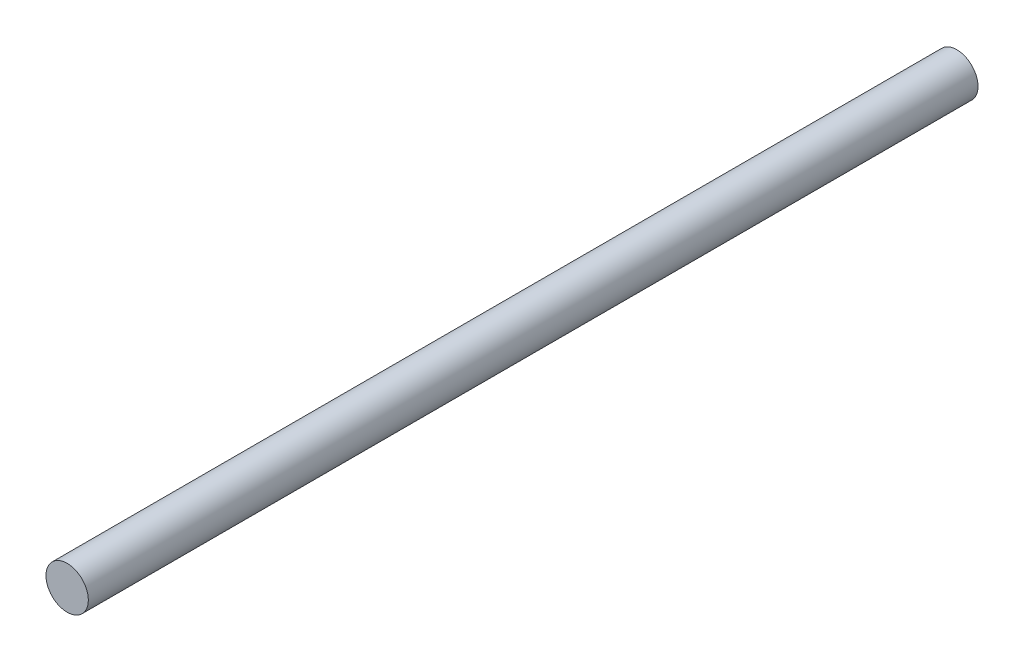
ISO-10303-21;
HEADER;
FILE_DESCRIPTION(('STEP AP214'),'2;1');
FILE_NAME('part.step','',(''),(''),'','','');
FILE_SCHEMA(('AUTOMOTIVE_DESIGN { 1 0 10303 214 1 1 1 1 }'));
ENDSEC;
DATA;
#1=APPLICATION_CONTEXT('core data for automotive mechanical design processes');
#2=APPLICATION_PROTOCOL_DEFINITION('international standard','automotive_design',2000,#1);
#3=PRODUCT_CONTEXT('',#1,'mechanical');
#4=PRODUCT('Part','Part','',(#3));
#5=PRODUCT_RELATED_PRODUCT_CATEGORY('part','',(#4));
#6=PRODUCT_DEFINITION_FORMATION('','',#4);
#7=PRODUCT_DEFINITION_CONTEXT('part definition',#1,'design');
#8=PRODUCT_DEFINITION('design','',#6,#7);
#9=PRODUCT_DEFINITION_SHAPE('','',#8);
#10=(LENGTH_UNIT() NAMED_UNIT(*) SI_UNIT(.MILLI.,.METRE.));
#11=(NAMED_UNIT(*) PLANE_ANGLE_UNIT() SI_UNIT($,.RADIAN.));
#12=(NAMED_UNIT(*) SI_UNIT($,.STERADIAN.) SOLID_ANGLE_UNIT());
#13=UNCERTAINTY_MEASURE_WITH_UNIT(LENGTH_MEASURE(1.E-05),#10,'distance_accuracy_value','');
#14=(GEOMETRIC_REPRESENTATION_CONTEXT(3) GLOBAL_UNCERTAINTY_ASSIGNED_CONTEXT((#13)) GLOBAL_UNIT_ASSIGNED_CONTEXT((#10,
#11,#12)) REPRESENTATION_CONTEXT('',''));
#15=CARTESIAN_POINT('',(0.,0.,0.));
#16=DIRECTION('',(0.,0.,1.));
#17=DIRECTION('',(1.,0.,0.));
#18=AXIS2_PLACEMENT_3D('',#15,#16,#17);
#19=CARTESIAN_POINT('',(0.,0.,105.));
#20=DIRECTION('',(0.,0.,-1.));
#21=DIRECTION('',(-1.,0.,0.));
#22=AXIS2_PLACEMENT_3D('',#19,#20,#21);
#23=CYLINDRICAL_SURFACE('',#22,2.5);
#24=CARTESIAN_POINT('',(0.,0.,105.));
#25=DIRECTION('',(0.,0.,1.));
#26=DIRECTION('',(1.,0.,0.));
#27=AXIS2_PLACEMENT_3D('',#24,#25,#26);
#28=CIRCLE('',#27,2.5);
#29=CARTESIAN_POINT('',(2.5,0.,105.));
#30=VERTEX_POINT('',#29);
#31=EDGE_CURVE('E10',#30,#30,#28,.T.);
#32=ORIENTED_EDGE('',*,*,#31,.F.);
#33=EDGE_LOOP('',(#32));
#34=FACE_BOUND('',#33,.T.);
#35=CARTESIAN_POINT('',(0.,0.,0.));
#36=DIRECTION('',(0.,0.,1.));
#37=DIRECTION('',(1.,0.,0.));
#38=AXIS2_PLACEMENT_3D('',#35,#36,#37);
#39=CIRCLE('',#38,2.5);
#40=CARTESIAN_POINT('',(2.5,0.,0.));
#41=VERTEX_POINT('',#40);
#42=EDGE_CURVE('E38',#41,#41,#39,.T.);
#43=ORIENTED_EDGE('',*,*,#42,.T.);
#44=EDGE_LOOP('',(#43));
#45=FACE_BOUND('',#44,.T.);
#46=ADVANCED_FACE('F35',(#34,#45),#23,.T.);
#47=CARTESIAN_POINT('',(0.,0.,105.));
#48=DIRECTION('',(0.,0.,1.));
#49=DIRECTION('',(1.,0.,0.));
#50=AXIS2_PLACEMENT_3D('',#47,#48,#49);
#51=PLANE('',#50);
#52=ORIENTED_EDGE('',*,*,#31,.T.);
#53=EDGE_LOOP('',(#52));
#54=FACE_BOUND('',#53,.T.);
#55=ADVANCED_FACE('F50',(#54),#51,.T.);
#56=CARTESIAN_POINT('',(0.,0.,0.));
#57=DIRECTION('',(0.,0.,1.));
#58=DIRECTION('',(1.,0.,0.));
#59=AXIS2_PLACEMENT_3D('',#56,#57,#58);
#60=PLANE('',#59);
#61=ORIENTED_EDGE('',*,*,#42,.F.);
#62=EDGE_LOOP('',(#61));
#63=FACE_BOUND('',#62,.T.);
#64=ADVANCED_FACE('F48',(#63),#60,.F.);
#65=CLOSED_SHELL('',(#46,#55,#64));
#66=MANIFOLD_SOLID_BREP('B2',#65);
#67=ADVANCED_BREP_SHAPE_REPRESENTATION('',(#18,#66),#14);
#68=SHAPE_DEFINITION_REPRESENTATION(#9,#67);
ENDSEC;
END-ISO-10303-21;
